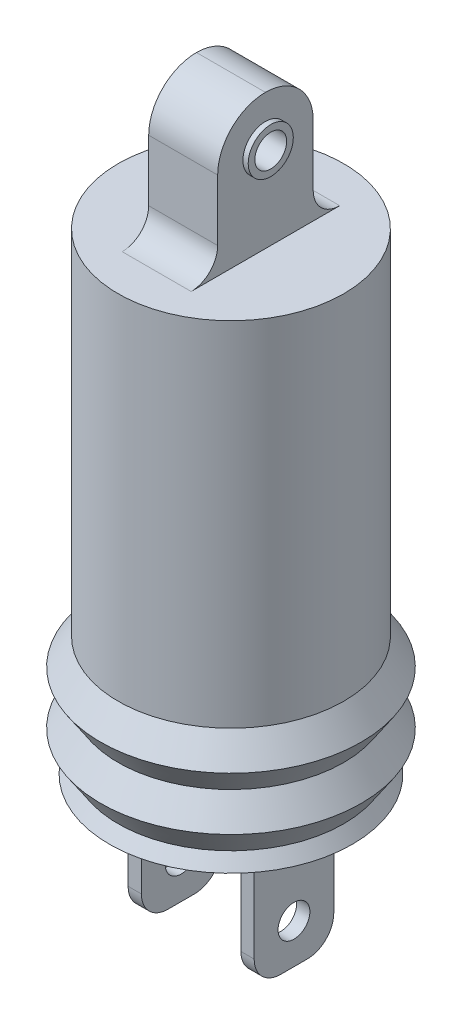
ISO-10303-21;
HEADER;
FILE_DESCRIPTION(('STEP AP214'),'2;1');
FILE_NAME('part.step','',(''),(''),'','','');
FILE_SCHEMA(('AUTOMOTIVE_DESIGN { 1 0 10303 214 1 1 1 1 }'));
ENDSEC;
DATA;
#1=APPLICATION_CONTEXT('core data for automotive mechanical design processes');
#2=APPLICATION_PROTOCOL_DEFINITION('international standard','automotive_design',2000,#1);
#3=PRODUCT_CONTEXT('',#1,'mechanical');
#4=PRODUCT('Part','Part','',(#3));
#5=PRODUCT_RELATED_PRODUCT_CATEGORY('part','',(#4));
#6=PRODUCT_DEFINITION_FORMATION('','',#4);
#7=PRODUCT_DEFINITION_CONTEXT('part definition',#1,'design');
#8=PRODUCT_DEFINITION('design','',#6,#7);
#9=PRODUCT_DEFINITION_SHAPE('','',#8);
#10=(LENGTH_UNIT() NAMED_UNIT(*) SI_UNIT(.MILLI.,.METRE.));
#11=(NAMED_UNIT(*) PLANE_ANGLE_UNIT() SI_UNIT($,.RADIAN.));
#12=(NAMED_UNIT(*) SI_UNIT($,.STERADIAN.) SOLID_ANGLE_UNIT());
#13=UNCERTAINTY_MEASURE_WITH_UNIT(LENGTH_MEASURE(1.E-05),#10,'distance_accuracy_value','');
#14=(GEOMETRIC_REPRESENTATION_CONTEXT(3) GLOBAL_UNCERTAINTY_ASSIGNED_CONTEXT((#13)) GLOBAL_UNIT_ASSIGNED_CONTEXT((#10,
#11,#12)) REPRESENTATION_CONTEXT('',''));
#15=CARTESIAN_POINT('',(0.,0.,0.));
#16=DIRECTION('',(0.,0.,1.));
#17=DIRECTION('',(1.,0.,0.));
#18=AXIS2_PLACEMENT_3D('',#15,#16,#17);
#19=CARTESIAN_POINT('',(13.,104.,18.));
#20=DIRECTION('',(-1.,0.,0.));
#21=DIRECTION('',(0.,0.,1.));
#22=AXIS2_PLACEMENT_3D('',#19,#20,#21);
#23=PLANE('',#22);
#24=CARTESIAN_POINT('',(13.,86.,0.));
#25=DIRECTION('',(-1.,0.,0.));
#26=DIRECTION('',(0.,0.,1.));
#27=AXIS2_PLACEMENT_3D('',#24,#25,#26);
#28=CIRCLE('',#27,18.);
#29=CARTESIAN_POINT('',(13.,86.,-18.));
#30=VERTEX_POINT('',#29);
#31=CARTESIAN_POINT('',(13.,104.,0.));
#32=VERTEX_POINT('',#31);
#33=EDGE_CURVE('E266',#30,#32,#28,.F.);
#34=ORIENTED_EDGE('',*,*,#33,.T.);
#35=CARTESIAN_POINT('',(13.,86.,0.));
#36=DIRECTION('',(-1.,0.,0.));
#37=DIRECTION('',(0.,0.,1.));
#38=AXIS2_PLACEMENT_3D('',#35,#36,#37);
#39=CIRCLE('',#38,18.);
#40=CARTESIAN_POINT('',(13.,86.,18.));
#41=VERTEX_POINT('',#40);
#42=EDGE_CURVE('E268',#32,#41,#39,.F.);
#43=ORIENTED_EDGE('',*,*,#42,.T.);
#44=DIRECTION('',(0.,-1.,0.));
#45=VECTOR('',#44,1.);
#46=CARTESIAN_POINT('',(13.,104.,18.));
#47=LINE('',#46,#45);
#48=CARTESIAN_POINT('',(13.,63.,18.));
#49=VERTEX_POINT('',#48);
#50=EDGE_CURVE('E225',#41,#49,#47,.T.);
#51=ORIENTED_EDGE('',*,*,#50,.T.);
#52=CARTESIAN_POINT('',(13.,63.,28.));
#53=DIRECTION('',(-1.,0.,0.));
#54=DIRECTION('',(0.,0.,1.));
#55=AXIS2_PLACEMENT_3D('',#52,#53,#54);
#56=CIRCLE('',#55,10.);
#57=CARTESIAN_POINT('',(13.,53.,28.));
#58=VERTEX_POINT('',#57);
#59=EDGE_CURVE('E295',#49,#58,#56,.T.);
#60=ORIENTED_EDGE('',*,*,#59,.T.);
#61=DIRECTION('',(0.,0.,-1.));
#62=VECTOR('',#61,1.);
#63=CARTESIAN_POINT('',(13.,53.,18.));
#64=LINE('',#63,#62);
#65=CARTESIAN_POINT('',(13.,53.,-28.));
#66=VERTEX_POINT('',#65);
#67=EDGE_CURVE('E221',#58,#66,#64,.T.);
#68=ORIENTED_EDGE('',*,*,#67,.T.);
#69=CARTESIAN_POINT('',(13.,63.,-28.));
#70=DIRECTION('',(-1.,0.,0.));
#71=DIRECTION('',(0.,0.,1.));
#72=AXIS2_PLACEMENT_3D('',#69,#70,#71);
#73=CIRCLE('',#72,10.);
#74=CARTESIAN_POINT('',(13.,63.,-18.));
#75=VERTEX_POINT('',#74);
#76=EDGE_CURVE('E303',#66,#75,#73,.T.);
#77=ORIENTED_EDGE('',*,*,#76,.T.);
#78=DIRECTION('',(0.,-1.,0.));
#79=VECTOR('',#78,1.);
#80=CARTESIAN_POINT('',(13.,104.,-18.));
#81=LINE('',#80,#79);
#82=EDGE_CURVE('E234',#30,#75,#81,.T.);
#83=ORIENTED_EDGE('',*,*,#82,.F.);
#84=EDGE_LOOP('',(#34,#43,#51,#60,#68,#77,#83));
#85=FACE_BOUND('',#84,.T.);
#86=CARTESIAN_POINT('',(13.,86.,0.));
#87=DIRECTION('',(-1.,0.,0.));
#88=DIRECTION('',(0.,0.,1.));
#89=AXIS2_PLACEMENT_3D('',#86,#87,#88);
#90=CIRCLE('',#89,8.50000000000001);
#91=CARTESIAN_POINT('',(13.,86.,8.50000000000001));
#92=VERTEX_POINT('',#91);
#93=EDGE_CURVE('E258',#92,#92,#90,.F.);
#94=ORIENTED_EDGE('',*,*,#93,.F.);
#95=EDGE_LOOP('',(#94));
#96=FACE_BOUND('',#95,.T.);
#97=ADVANCED_FACE('F34',(#85,#96),#23,.F.);
#98=CARTESIAN_POINT('',(0.,-129.999999999998,0.));
#99=DIRECTION('',(0.,-1.,0.));
#100=DIRECTION('',(0.,0.,-1.));
#101=AXIS2_PLACEMENT_3D('',#98,#99,#100);
#102=PLANE('',#101);
#103=DIRECTION('',(1.,0.,0.));
#104=VECTOR('',#103,1.);
#105=CARTESIAN_POINT('',(-23.75,-129.999999999998,-15.));
#106=LINE('',#105,#104);
#107=CARTESIAN_POINT('',(-18.75,-129.999999999998,-15.));
#108=VERTEX_POINT('',#107);
#109=CARTESIAN_POINT('',(18.75,-129.999999999998,-15.));
#110=VERTEX_POINT('',#109);
#111=EDGE_CURVE('E187',#108,#110,#106,.T.);
#112=ORIENTED_EDGE('',*,*,#111,.T.);
#113=DIRECTION('',(0.,0.,-1.));
#114=VECTOR('',#113,1.);
#115=CARTESIAN_POINT('',(18.75,-129.999999999998,-15.));
#116=LINE('',#115,#114);
#117=CARTESIAN_POINT('',(18.75,-129.999999999998,15.));
#118=VERTEX_POINT('',#117);
#119=EDGE_CURVE('E185',#118,#110,#116,.T.);
#120=ORIENTED_EDGE('',*,*,#119,.F.);
#121=DIRECTION('',(1.,0.,0.));
#122=VECTOR('',#121,1.);
#123=CARTESIAN_POINT('',(-23.75,-129.999999999998,15.));
#124=LINE('',#123,#122);
#125=CARTESIAN_POINT('',(-18.75,-129.999999999998,15.));
#126=VERTEX_POINT('',#125);
#127=EDGE_CURVE('E168',#126,#118,#124,.T.);
#128=ORIENTED_EDGE('',*,*,#127,.F.);
#129=DIRECTION('',(0.,0.,1.));
#130=VECTOR('',#129,1.);
#131=CARTESIAN_POINT('',(-18.75,-129.999999999998,-15.));
#132=LINE('',#131,#130);
#133=EDGE_CURVE('E182',#108,#126,#132,.T.);
#134=ORIENTED_EDGE('',*,*,#133,.F.);
#135=EDGE_LOOP('',(#112,#120,#128,#134));
#136=FACE_BOUND('',#135,.T.);
#137=ADVANCED_FACE('F181',(#136),#102,.T.);
#138=CARTESIAN_POINT('',(-45.816624790353,-124.999999999998,0.));
#139=DIRECTION('',(0.,1.,0.));
#140=DIRECTION('',(-1.,0.,0.));
#141=AXIS2_PLACEMENT_3D('',#138,#139,#140);
#142=PLANE('',#141);
#143=CARTESIAN_POINT('',(0.,-124.999999999998,0.));
#144=DIRECTION('',(0.,-1.,0.));
#145=DIRECTION('',(1.,0.,0.));
#146=AXIS2_PLACEMENT_3D('',#143,#144,#145);
#147=CIRCLE('',#146,45.816624790353);
#148=CARTESIAN_POINT('',(45.816624790353,-124.999999999998,0.));
#149=VERTEX_POINT('',#148);
#150=EDGE_CURVE('E240',#149,#149,#147,.T.);
#151=ORIENTED_EDGE('',*,*,#150,.T.);
#152=EDGE_LOOP('',(#151));
#153=FACE_BOUND('',#152,.T.);
#154=DIRECTION('',(1.,0.,0.));
#155=VECTOR('',#154,1.);
#156=CARTESIAN_POINT('',(-23.75,-124.999999999998,-15.));
#157=LINE('',#156,#155);
#158=CARTESIAN_POINT('',(-23.75,-124.999999999998,-15.));
#159=VERTEX_POINT('',#158);
#160=CARTESIAN_POINT('',(23.75,-124.999999999998,-15.));
#161=VERTEX_POINT('',#160);
#162=EDGE_CURVE('E201',#159,#161,#157,.T.);
#163=ORIENTED_EDGE('',*,*,#162,.F.);
#164=DIRECTION('',(0.,0.,1.));
#165=VECTOR('',#164,1.);
#166=CARTESIAN_POINT('',(-23.75,-124.999999999998,-15.));
#167=LINE('',#166,#165);
#168=CARTESIAN_POINT('',(-23.75,-124.999999999998,15.));
#169=VERTEX_POINT('',#168);
#170=EDGE_CURVE('E202',#159,#169,#167,.T.);
#171=ORIENTED_EDGE('',*,*,#170,.T.);
#172=DIRECTION('',(1.,0.,0.));
#173=VECTOR('',#172,1.);
#174=CARTESIAN_POINT('',(-23.75,-124.999999999998,15.));
#175=LINE('',#174,#173);
#176=CARTESIAN_POINT('',(23.75,-124.999999999998,15.));
#177=VERTEX_POINT('',#176);
#178=EDGE_CURVE('E209',#169,#177,#175,.T.);
#179=ORIENTED_EDGE('',*,*,#178,.T.);
#180=DIRECTION('',(0.,0.,1.));
#181=VECTOR('',#180,1.);
#182=CARTESIAN_POINT('',(23.75,-124.999999999998,-15.));
#183=LINE('',#182,#181);
#184=EDGE_CURVE('E206',#161,#177,#183,.T.);
#185=ORIENTED_EDGE('',*,*,#184,.F.);
#186=EDGE_LOOP('',(#163,#171,#179,#185));
#187=FACE_BOUND('',#186,.T.);
#188=ADVANCED_FACE('F356',(#153,#187),#142,.F.);
#189=CARTESIAN_POINT('',(-42.5,53.,0.));
#190=DIRECTION('',(0.,-1.,0.));
#191=DIRECTION('',(1.,0.,0.));
#192=AXIS2_PLACEMENT_3D('',#189,#190,#191);
#193=PLANE('',#192);
#194=CARTESIAN_POINT('',(0.,53.,0.));
#195=DIRECTION('',(0.,-1.,0.));
#196=DIRECTION('',(1.,0.,0.));
#197=AXIS2_PLACEMENT_3D('',#194,#195,#196);
#198=CIRCLE('',#197,42.5);
#199=CARTESIAN_POINT('',(42.5,53.,0.));
#200=VERTEX_POINT('',#199);
#201=EDGE_CURVE('E237',#200,#200,#198,.T.);
#202=ORIENTED_EDGE('',*,*,#201,.F.);
#203=EDGE_LOOP('',(#202));
#204=FACE_BOUND('',#203,.T.);
#205=ORIENTED_EDGE('',*,*,#67,.F.);
#206=DIRECTION('',(1.,0.,0.));
#207=VECTOR('',#206,1.);
#208=CARTESIAN_POINT('',(-13.,53.,28.));
#209=LINE('',#208,#207);
#210=CARTESIAN_POINT('',(-13.,53.,28.));
#211=VERTEX_POINT('',#210);
#212=EDGE_CURVE('E289',#58,#211,#209,.F.);
#213=ORIENTED_EDGE('',*,*,#212,.T.);
#214=DIRECTION('',(0.,0.,1.));
#215=VECTOR('',#214,1.);
#216=CARTESIAN_POINT('',(-13.,53.,18.));
#217=LINE('',#216,#215);
#218=CARTESIAN_POINT('',(-13.,53.,-28.));
#219=VERTEX_POINT('',#218);
#220=EDGE_CURVE('E223',#219,#211,#217,.T.);
#221=ORIENTED_EDGE('',*,*,#220,.F.);
#222=DIRECTION('',(-1.,0.,0.));
#223=VECTOR('',#222,1.);
#224=CARTESIAN_POINT('',(13.,53.,-28.));
#225=LINE('',#224,#223);
#226=EDGE_CURVE('E286',#219,#66,#225,.F.);
#227=ORIENTED_EDGE('',*,*,#226,.T.);
#228=EDGE_LOOP('',(#205,#213,#221,#227));
#229=FACE_BOUND('',#228,.T.);
#230=ADVANCED_FACE('F438',(#204,#229),#193,.F.);
#231=CARTESIAN_POINT('',(0.,-80.,0.));
#232=DIRECTION('',(0.,-1.,0.));
#233=DIRECTION('',(1.,0.,0.));
#234=AXIS2_PLACEMENT_3D('',#231,#232,#233);
#235=CONICAL_SURFACE('',#234,42.4999999999992,0.585685543457138);
#236=CARTESIAN_POINT('',(0.,-90.0000000000001,0.));
#237=DIRECTION('',(0.,-1.,0.));
#238=DIRECTION('',(1.,0.,0.));
#239=AXIS2_PLACEMENT_3D('',#236,#237,#238);
#240=CIRCLE('',#239,49.1332495807099);
#241=CARTESIAN_POINT('',(49.1332495807099,-90.0000000000001,0.));
#242=VERTEX_POINT('',#241);
#243=EDGE_CURVE('E252',#242,#242,#240,.T.);
#244=ORIENTED_EDGE('',*,*,#243,.F.);
#245=EDGE_LOOP('',(#244));
#246=FACE_BOUND('',#245,.T.);
#247=CARTESIAN_POINT('',(0.,-80.,0.));
#248=DIRECTION('',(0.,-1.,0.));
#249=DIRECTION('',(1.,0.,0.));
#250=AXIS2_PLACEMENT_3D('',#247,#248,#249);
#251=CIRCLE('',#250,42.4999999999992);
#252=CARTESIAN_POINT('',(42.4999999999992,-80.,0.));
#253=VERTEX_POINT('',#252);
#254=EDGE_CURVE('E255',#253,#253,#251,.T.);
#255=ORIENTED_EDGE('',*,*,#254,.T.);
#256=EDGE_LOOP('',(#255));
#257=FACE_BOUND('',#256,.T.);
#258=ADVANCED_FACE('F441',(#246,#257),#235,.T.);
#259=CARTESIAN_POINT('',(0.,-90.0000000000001,0.));
#260=DIRECTION('',(0.,1.,0.));
#261=DIRECTION('',(-1.,0.,0.));
#262=AXIS2_PLACEMENT_3D('',#259,#260,#261);
#263=CONICAL_SURFACE('',#262,49.1332495807099,0.585685543457162);
#264=CARTESIAN_POINT('',(0.,-100.,0.));
#265=DIRECTION('',(0.,-1.,0.));
#266=DIRECTION('',(1.,0.,0.));
#267=AXIS2_PLACEMENT_3D('',#264,#265,#266);
#268=CIRCLE('',#267,42.4999999999989);
#269=CARTESIAN_POINT('',(42.4999999999989,-100.,0.));
#270=VERTEX_POINT('',#269);
#271=EDGE_CURVE('E249',#270,#270,#268,.T.);
#272=ORIENTED_EDGE('',*,*,#271,.F.);
#273=EDGE_LOOP('',(#272));
#274=FACE_BOUND('',#273,.T.);
#275=ORIENTED_EDGE('',*,*,#243,.T.);
#276=EDGE_LOOP('',(#275));
#277=FACE_BOUND('',#276,.T.);
#278=ADVANCED_FACE('F456',(#274,#277),#263,.T.);
#279=CARTESIAN_POINT('',(0.,-100.,0.));
#280=DIRECTION('',(0.,-1.,0.));
#281=DIRECTION('',(1.,0.,0.));
#282=AXIS2_PLACEMENT_3D('',#279,#280,#281);
#283=CONICAL_SURFACE('',#282,42.4999999999989,0.58568554345714);
#284=CARTESIAN_POINT('',(0.,-110.,0.));
#285=DIRECTION('',(0.,-1.,0.));
#286=DIRECTION('',(1.,0.,0.));
#287=AXIS2_PLACEMENT_3D('',#284,#285,#286);
#288=CIRCLE('',#287,49.1332495807096);
#289=CARTESIAN_POINT('',(49.1332495807096,-110.,0.));
#290=VERTEX_POINT('',#289);
#291=EDGE_CURVE('E246',#290,#290,#288,.T.);
#292=ORIENTED_EDGE('',*,*,#291,.F.);
#293=EDGE_LOOP('',(#292));
#294=FACE_BOUND('',#293,.T.);
#295=ORIENTED_EDGE('',*,*,#271,.T.);
#296=EDGE_LOOP('',(#295));
#297=FACE_BOUND('',#296,.T.);
#298=ADVANCED_FACE('F452',(#294,#297),#283,.T.);
#299=CARTESIAN_POINT('',(0.,-110.,0.));
#300=DIRECTION('',(0.,1.,0.));
#301=DIRECTION('',(-1.,0.,0.));
#302=AXIS2_PLACEMENT_3D('',#299,#300,#301);
#303=CONICAL_SURFACE('',#302,49.1332495807096,0.585685543457163);
#304=CARTESIAN_POINT('',(0.,-120.,0.));
#305=DIRECTION('',(0.,-1.,0.));
#306=DIRECTION('',(1.,0.,0.));
#307=AXIS2_PLACEMENT_3D('',#304,#305,#306);
#308=CIRCLE('',#307,42.4999999999987);
#309=CARTESIAN_POINT('',(42.4999999999987,-120.,0.));
#310=VERTEX_POINT('',#309);
#311=EDGE_CURVE('E243',#310,#310,#308,.T.);
#312=ORIENTED_EDGE('',*,*,#311,.F.);
#313=EDGE_LOOP('',(#312));
#314=FACE_BOUND('',#313,.T.);
#315=ORIENTED_EDGE('',*,*,#291,.T.);
#316=EDGE_LOOP('',(#315));
#317=FACE_BOUND('',#316,.T.);
#318=ADVANCED_FACE('F448',(#314,#317),#303,.T.);
#319=CARTESIAN_POINT('',(0.,-120.,0.));
#320=DIRECTION('',(0.,-1.,0.));
#321=DIRECTION('',(1.,0.,0.));
#322=AXIS2_PLACEMENT_3D('',#319,#320,#321);
#323=CONICAL_SURFACE('',#322,42.4999999999987,0.585685543457146);
#324=ORIENTED_EDGE('',*,*,#150,.F.);
#325=EDGE_LOOP('',(#324));
#326=FACE_BOUND('',#325,.T.);
#327=ORIENTED_EDGE('',*,*,#311,.T.);
#328=EDGE_LOOP('',(#327));
#329=FACE_BOUND('',#328,.T.);
#330=ADVANCED_FACE('F436',(#326,#329),#323,.T.);
#331=CARTESIAN_POINT('',(0.,-124.999999999998,0.));
#332=DIRECTION('',(0.,-1.,0.));
#333=DIRECTION('',(1.,0.,0.));
#334=AXIS2_PLACEMENT_3D('',#331,#332,#333);
#335=CYLINDRICAL_SURFACE('',#334,42.5);
#336=ORIENTED_EDGE('',*,*,#254,.F.);
#337=EDGE_LOOP('',(#336));
#338=FACE_BOUND('',#337,.T.);
#339=ORIENTED_EDGE('',*,*,#201,.T.);
#340=EDGE_LOOP('',(#339));
#341=FACE_BOUND('',#340,.T.);
#342=ADVANCED_FACE('F433',(#338,#341),#335,.T.);
#343=CARTESIAN_POINT('',(-13.,104.,-18.));
#344=DIRECTION('',(0.,0.,1.));
#345=DIRECTION('',(1.,0.,0.));
#346=AXIS2_PLACEMENT_3D('',#343,#344,#345);
#347=PLANE('',#346);
#348=ORIENTED_EDGE('',*,*,#82,.T.);
#349=DIRECTION('',(-1.,0.,0.));
#350=VECTOR('',#349,1.);
#351=CARTESIAN_POINT('',(-13.,63.,-18.));
#352=LINE('',#351,#350);
#353=CARTESIAN_POINT('',(-13.,63.,-18.));
#354=VERTEX_POINT('',#353);
#355=EDGE_CURVE('E292',#75,#354,#352,.T.);
#356=ORIENTED_EDGE('',*,*,#355,.T.);
#357=DIRECTION('',(0.,-1.,0.));
#358=VECTOR('',#357,1.);
#359=CARTESIAN_POINT('',(-13.,104.,-18.));
#360=LINE('',#359,#358);
#361=CARTESIAN_POINT('',(-13.,86.,-18.));
#362=VERTEX_POINT('',#361);
#363=EDGE_CURVE('E231',#362,#354,#360,.T.);
#364=ORIENTED_EDGE('',*,*,#363,.F.);
#365=DIRECTION('',(-1.,0.,0.));
#366=VECTOR('',#365,1.);
#367=CARTESIAN_POINT('',(-13.,86.,-18.));
#368=LINE('',#367,#366);
#369=EDGE_CURVE('E277',#362,#30,#368,.F.);
#370=ORIENTED_EDGE('',*,*,#369,.T.);
#371=EDGE_LOOP('',(#348,#356,#364,#370));
#372=FACE_BOUND('',#371,.T.);
#373=ADVANCED_FACE('F431',(#372),#347,.F.);
#374=CARTESIAN_POINT('',(-13.,104.,18.));
#375=DIRECTION('',(1.,0.,0.));
#376=DIRECTION('',(0.,0.,-1.));
#377=AXIS2_PLACEMENT_3D('',#374,#375,#376);
#378=PLANE('',#377);
#379=CARTESIAN_POINT('',(-13.,86.,0.));
#380=DIRECTION('',(1.,0.,0.));
#381=DIRECTION('',(0.,0.,-1.));
#382=AXIS2_PLACEMENT_3D('',#379,#380,#381);
#383=CIRCLE('',#382,8.50000000000001);
#384=CARTESIAN_POINT('',(-13.,86.,-8.5));
#385=VERTEX_POINT('',#384);
#386=EDGE_CURVE('E394',#385,#385,#383,.T.);
#387=ORIENTED_EDGE('',*,*,#386,.T.);
#388=EDGE_LOOP('',(#387));
#389=FACE_BOUND('',#388,.T.);
#390=DIRECTION('',(0.,-1.,0.));
#391=VECTOR('',#390,1.);
#392=CARTESIAN_POINT('',(-13.,104.,18.));
#393=LINE('',#392,#391);
#394=CARTESIAN_POINT('',(-13.,86.,18.));
#395=VERTEX_POINT('',#394);
#396=CARTESIAN_POINT('',(-13.,63.,18.));
#397=VERTEX_POINT('',#396);
#398=EDGE_CURVE('E228',#395,#397,#393,.T.);
#399=ORIENTED_EDGE('',*,*,#398,.F.);
#400=CARTESIAN_POINT('',(-13.,86.,0.));
#401=DIRECTION('',(1.,0.,0.));
#402=DIRECTION('',(0.,0.,-1.));
#403=AXIS2_PLACEMENT_3D('',#400,#401,#402);
#404=CIRCLE('',#403,18.);
#405=CARTESIAN_POINT('',(-13.,104.,0.));
#406=VERTEX_POINT('',#405);
#407=EDGE_CURVE('E275',#395,#406,#404,.F.);
#408=ORIENTED_EDGE('',*,*,#407,.T.);
#409=CARTESIAN_POINT('',(-13.,86.,0.));
#410=DIRECTION('',(1.,0.,0.));
#411=DIRECTION('',(0.,0.,-1.));
#412=AXIS2_PLACEMENT_3D('',#409,#410,#411);
#413=CIRCLE('',#412,18.);
#414=EDGE_CURVE('E273',#406,#362,#413,.F.);
#415=ORIENTED_EDGE('',*,*,#414,.T.);
#416=ORIENTED_EDGE('',*,*,#363,.T.);
#417=CARTESIAN_POINT('',(-13.,63.,-28.));
#418=DIRECTION('',(1.,0.,0.));
#419=DIRECTION('',(0.,0.,-1.));
#420=AXIS2_PLACEMENT_3D('',#417,#418,#419);
#421=CIRCLE('',#420,10.);
#422=EDGE_CURVE('E300',#354,#219,#421,.T.);
#423=ORIENTED_EDGE('',*,*,#422,.T.);
#424=ORIENTED_EDGE('',*,*,#220,.T.);
#425=CARTESIAN_POINT('',(-13.,63.,28.));
#426=DIRECTION('',(1.,0.,0.));
#427=DIRECTION('',(0.,0.,-1.));
#428=AXIS2_PLACEMENT_3D('',#425,#426,#427);
#429=CIRCLE('',#428,10.);
#430=EDGE_CURVE('E298',#211,#397,#429,.T.);
#431=ORIENTED_EDGE('',*,*,#430,.T.);
#432=EDGE_LOOP('',(#399,#408,#415,#416,#423,#424,#431));
#433=FACE_BOUND('',#432,.T.);
#434=ADVANCED_FACE('F604',(#389,#433),#378,.F.);
#435=CARTESIAN_POINT('',(-13.,104.,18.));
#436=DIRECTION('',(0.,0.,-1.));
#437=DIRECTION('',(-1.,0.,0.));
#438=AXIS2_PLACEMENT_3D('',#435,#436,#437);
#439=PLANE('',#438);
#440=ORIENTED_EDGE('',*,*,#398,.T.);
#441=DIRECTION('',(1.,0.,0.));
#442=VECTOR('',#441,1.);
#443=CARTESIAN_POINT('',(13.,63.,18.));
#444=LINE('',#443,#442);
#445=EDGE_CURVE('E279',#397,#49,#444,.T.);
#446=ORIENTED_EDGE('',*,*,#445,.T.);
#447=ORIENTED_EDGE('',*,*,#50,.F.);
#448=DIRECTION('',(1.,0.,0.));
#449=VECTOR('',#448,1.);
#450=CARTESIAN_POINT('',(-13.,86.,18.));
#451=LINE('',#450,#449);
#452=EDGE_CURVE('E270',#41,#395,#451,.F.);
#453=ORIENTED_EDGE('',*,*,#452,.T.);
#454=EDGE_LOOP('',(#440,#446,#447,#453));
#455=FACE_BOUND('',#454,.T.);
#456=ADVANCED_FACE('F582',(#455),#439,.F.);
#457=CARTESIAN_POINT('',(-23.75,-129.999999999998,-15.));
#458=DIRECTION('',(0.,0.,1.));
#459=DIRECTION('',(1.,0.,0.));
#460=AXIS2_PLACEMENT_3D('',#457,#458,#459);
#461=PLANE('',#460);
#462=DIRECTION('',(0.,1.,0.));
#463=VECTOR('',#462,1.);
#464=CARTESIAN_POINT('',(23.75,-129.999999999998,-15.));
#465=LINE('',#464,#463);
#466=CARTESIAN_POINT('',(23.75,-165.999999999998,-15.));
#467=VERTEX_POINT('',#466);
#468=EDGE_CURVE('E219',#467,#161,#465,.T.);
#469=ORIENTED_EDGE('',*,*,#468,.F.);
#470=DIRECTION('',(1.,0.,0.));
#471=VECTOR('',#470,1.);
#472=CARTESIAN_POINT('',(18.75,-165.999999999998,-15.));
#473=LINE('',#472,#471);
#474=CARTESIAN_POINT('',(18.75,-165.999999999998,-15.));
#475=VERTEX_POINT('',#474);
#476=EDGE_CURVE('E11',#467,#475,#473,.F.);
#477=ORIENTED_EDGE('',*,*,#476,.T.);
#478=DIRECTION('',(0.,1.,0.));
#479=VECTOR('',#478,1.);
#480=CARTESIAN_POINT('',(18.75,-175.999999999998,-15.));
#481=LINE('',#480,#479);
#482=EDGE_CURVE('E196',#475,#110,#481,.T.);
#483=ORIENTED_EDGE('',*,*,#482,.T.);
#484=ORIENTED_EDGE('',*,*,#111,.F.);
#485=DIRECTION('',(0.,1.,0.));
#486=VECTOR('',#485,1.);
#487=CARTESIAN_POINT('',(-18.75,-175.999999999998,-15.));
#488=LINE('',#487,#486);
#489=CARTESIAN_POINT('',(-18.75,-165.999999999998,-15.));
#490=VERTEX_POINT('',#489);
#491=EDGE_CURVE('E174',#490,#108,#488,.T.);
#492=ORIENTED_EDGE('',*,*,#491,.F.);
#493=DIRECTION('',(1.,0.,0.));
#494=VECTOR('',#493,1.);
#495=CARTESIAN_POINT('',(-23.75,-165.999999999998,-15.));
#496=LINE('',#495,#494);
#497=CARTESIAN_POINT('',(-23.75,-165.999999999998,-15.));
#498=VERTEX_POINT('',#497);
#499=EDGE_CURVE('E42',#490,#498,#496,.F.);
#500=ORIENTED_EDGE('',*,*,#499,.T.);
#501=DIRECTION('',(0.,1.,0.));
#502=VECTOR('',#501,1.);
#503=CARTESIAN_POINT('',(-23.75,-129.999999999998,-15.));
#504=LINE('',#503,#502);
#505=EDGE_CURVE('E186',#498,#159,#504,.T.);
#506=ORIENTED_EDGE('',*,*,#505,.T.);
#507=ORIENTED_EDGE('',*,*,#162,.T.);
#508=EDGE_LOOP('',(#469,#477,#483,#484,#492,#500,#506,#507));
#509=FACE_BOUND('',#508,.T.);
#510=ADVANCED_FACE('F336',(#509),#461,.F.);
#511=CARTESIAN_POINT('',(23.75,-129.999999999998,-15.));
#512=DIRECTION('',(-1.,0.,0.));
#513=DIRECTION('',(0.,0.,1.));
#514=AXIS2_PLACEMENT_3D('',#511,#512,#513);
#515=PLANE('',#514);
#516=CARTESIAN_POINT('',(23.75,-160.999999999998,0.));
#517=DIRECTION('',(1.,0.,0.));
#518=DIRECTION('',(0.,0.,-1.));
#519=AXIS2_PLACEMENT_3D('',#516,#517,#518);
#520=CIRCLE('',#519,6.00000000000001);
#521=CARTESIAN_POINT('',(23.75,-160.999999999998,-6.00000000000001));
#522=VERTEX_POINT('',#521);
#523=EDGE_CURVE('E263',#522,#522,#520,.T.);
#524=ORIENTED_EDGE('',*,*,#523,.F.);
#525=EDGE_LOOP('',(#524));
#526=FACE_BOUND('',#525,.T.);
#527=DIRECTION('',(0.,1.,0.));
#528=VECTOR('',#527,1.);
#529=CARTESIAN_POINT('',(23.75,-129.999999999998,15.));
#530=LINE('',#529,#528);
#531=CARTESIAN_POINT('',(23.75,-165.999999999998,15.));
#532=VERTEX_POINT('',#531);
#533=EDGE_CURVE('E217',#532,#177,#530,.T.);
#534=ORIENTED_EDGE('',*,*,#533,.F.);
#535=CARTESIAN_POINT('',(23.75,-165.999999999998,5.));
#536=DIRECTION('',(-1.,0.,0.));
#537=DIRECTION('',(0.,0.,1.));
#538=AXIS2_PLACEMENT_3D('',#535,#536,#537);
#539=CIRCLE('',#538,10.);
#540=CARTESIAN_POINT('',(23.75,-175.999999999998,5.));
#541=VERTEX_POINT('',#540);
#542=EDGE_CURVE('E333',#532,#541,#539,.F.);
#543=ORIENTED_EDGE('',*,*,#542,.T.);
#544=DIRECTION('',(0.,0.,1.));
#545=VECTOR('',#544,1.);
#546=CARTESIAN_POINT('',(23.75,-175.999999999998,-15.));
#547=LINE('',#546,#545);
#548=CARTESIAN_POINT('',(23.75,-175.999999999998,-5.));
#549=VERTEX_POINT('',#548);
#550=EDGE_CURVE('E372',#549,#541,#547,.T.);
#551=ORIENTED_EDGE('',*,*,#550,.F.);
#552=CARTESIAN_POINT('',(23.75,-165.999999999998,-5.));
#553=DIRECTION('',(-1.,0.,0.));
#554=DIRECTION('',(0.,0.,1.));
#555=AXIS2_PLACEMENT_3D('',#552,#553,#554);
#556=CIRCLE('',#555,10.);
#557=EDGE_CURVE('E49',#549,#467,#556,.F.);
#558=ORIENTED_EDGE('',*,*,#557,.T.);
#559=ORIENTED_EDGE('',*,*,#468,.T.);
#560=ORIENTED_EDGE('',*,*,#184,.T.);
#561=EDGE_LOOP('',(#534,#543,#551,#558,#559,#560));
#562=FACE_BOUND('',#561,.T.);
#563=ADVANCED_FACE('F357',(#526,#562),#515,.F.);
#564=CARTESIAN_POINT('',(-23.75,-129.999999999998,15.));
#565=DIRECTION('',(0.,0.,1.));
#566=DIRECTION('',(1.,0.,0.));
#567=AXIS2_PLACEMENT_3D('',#564,#565,#566);
#568=PLANE('',#567);
#569=DIRECTION('',(0.,1.,0.));
#570=VECTOR('',#569,1.);
#571=CARTESIAN_POINT('',(-23.75,-129.999999999998,15.));
#572=LINE('',#571,#570);
#573=CARTESIAN_POINT('',(-23.75,-165.999999999998,15.));
#574=VERTEX_POINT('',#573);
#575=EDGE_CURVE('E215',#574,#169,#572,.T.);
#576=ORIENTED_EDGE('',*,*,#575,.F.);
#577=DIRECTION('',(-1.,0.,0.));
#578=VECTOR('',#577,1.);
#579=CARTESIAN_POINT('',(-18.75,-165.999999999998,15.));
#580=LINE('',#579,#578);
#581=CARTESIAN_POINT('',(-18.75,-165.999999999998,15.));
#582=VERTEX_POINT('',#581);
#583=EDGE_CURVE('E170',#574,#582,#580,.F.);
#584=ORIENTED_EDGE('',*,*,#583,.T.);
#585=DIRECTION('',(0.,1.,0.));
#586=VECTOR('',#585,1.);
#587=CARTESIAN_POINT('',(-18.75,-175.999999999998,15.));
#588=LINE('',#587,#586);
#589=EDGE_CURVE('E163',#582,#126,#588,.T.);
#590=ORIENTED_EDGE('',*,*,#589,.T.);
#591=ORIENTED_EDGE('',*,*,#127,.T.);
#592=DIRECTION('',(0.,1.,0.));
#593=VECTOR('',#592,1.);
#594=CARTESIAN_POINT('',(18.75,-175.999999999998,15.));
#595=LINE('',#594,#593);
#596=CARTESIAN_POINT('',(18.75,-165.999999999998,15.));
#597=VERTEX_POINT('',#596);
#598=EDGE_CURVE('E192',#597,#118,#595,.T.);
#599=ORIENTED_EDGE('',*,*,#598,.F.);
#600=DIRECTION('',(-1.,0.,0.));
#601=VECTOR('',#600,1.);
#602=CARTESIAN_POINT('',(-23.75,-165.999999999998,15.));
#603=LINE('',#602,#601);
#604=EDGE_CURVE('E315',#597,#532,#603,.F.);
#605=ORIENTED_EDGE('',*,*,#604,.T.);
#606=ORIENTED_EDGE('',*,*,#533,.T.);
#607=ORIENTED_EDGE('',*,*,#178,.F.);
#608=EDGE_LOOP('',(#576,#584,#590,#591,#599,#605,#606,#607));
#609=FACE_BOUND('',#608,.T.);
#610=ADVANCED_FACE('F166',(#609),#568,.T.);
#611=CARTESIAN_POINT('',(-23.75,-129.999999999998,-15.));
#612=DIRECTION('',(-1.,0.,0.));
#613=DIRECTION('',(0.,0.,1.));
#614=AXIS2_PLACEMENT_3D('',#611,#612,#613);
#615=PLANE('',#614);
#616=CARTESIAN_POINT('',(-23.75,-160.999999999998,0.));
#617=DIRECTION('',(-1.,0.,0.));
#618=DIRECTION('',(0.,0.,1.));
#619=AXIS2_PLACEMENT_3D('',#616,#617,#618);
#620=CIRCLE('',#619,6.00000000000001);
#621=CARTESIAN_POINT('',(-23.75,-160.999999999998,6.00000000000001));
#622=VERTEX_POINT('',#621);
#623=EDGE_CURVE('E378',#622,#622,#620,.T.);
#624=ORIENTED_EDGE('',*,*,#623,.F.);
#625=EDGE_LOOP('',(#624));
#626=FACE_BOUND('',#625,.T.);
#627=DIRECTION('',(0.,0.,-1.));
#628=VECTOR('',#627,1.);
#629=CARTESIAN_POINT('',(-23.75,-175.999999999998,-15.));
#630=LINE('',#629,#628);
#631=CARTESIAN_POINT('',(-23.75,-175.999999999998,5.));
#632=VERTEX_POINT('',#631);
#633=CARTESIAN_POINT('',(-23.75,-175.999999999998,-5.));
#634=VERTEX_POINT('',#633);
#635=EDGE_CURVE('E191',#632,#634,#630,.T.);
#636=ORIENTED_EDGE('',*,*,#635,.F.);
#637=CARTESIAN_POINT('',(-23.75,-165.999999999998,5.));
#638=DIRECTION('',(-1.,0.,0.));
#639=DIRECTION('',(0.,0.,1.));
#640=AXIS2_PLACEMENT_3D('',#637,#638,#639);
#641=CIRCLE('',#640,10.);
#642=EDGE_CURVE('E313',#632,#574,#641,.T.);
#643=ORIENTED_EDGE('',*,*,#642,.T.);
#644=ORIENTED_EDGE('',*,*,#575,.T.);
#645=ORIENTED_EDGE('',*,*,#170,.F.);
#646=ORIENTED_EDGE('',*,*,#505,.F.);
#647=CARTESIAN_POINT('',(-23.75,-165.999999999998,-5.));
#648=DIRECTION('',(-1.,0.,0.));
#649=DIRECTION('',(0.,0.,1.));
#650=AXIS2_PLACEMENT_3D('',#647,#648,#649);
#651=CIRCLE('',#650,10.);
#652=EDGE_CURVE('E311',#498,#634,#651,.T.);
#653=ORIENTED_EDGE('',*,*,#652,.T.);
#654=EDGE_LOOP('',(#636,#643,#644,#645,#646,#653));
#655=FACE_BOUND('',#654,.T.);
#656=ADVANCED_FACE('F343',(#626,#655),#615,.T.);
#657=CARTESIAN_POINT('',(-18.75,-175.999999999998,-15.));
#658=DIRECTION('',(-1.,0.,0.));
#659=DIRECTION('',(0.,0.,1.));
#660=AXIS2_PLACEMENT_3D('',#657,#658,#659);
#661=PLANE('',#660);
#662=CARTESIAN_POINT('',(-18.75,-160.999999999998,0.));
#663=DIRECTION('',(-1.,0.,0.));
#664=DIRECTION('',(0.,0.,1.));
#665=AXIS2_PLACEMENT_3D('',#662,#663,#664);
#666=CIRCLE('',#665,6.00000000000001);
#667=CARTESIAN_POINT('',(-18.75,-160.999999999998,6.00000000000001));
#668=VERTEX_POINT('',#667);
#669=EDGE_CURVE('E262',#668,#668,#666,.T.);
#670=ORIENTED_EDGE('',*,*,#669,.T.);
#671=EDGE_LOOP('',(#670));
#672=FACE_BOUND('',#671,.T.);
#673=ORIENTED_EDGE('',*,*,#589,.F.);
#674=CARTESIAN_POINT('',(-18.75,-165.999999999998,5.));
#675=DIRECTION('',(-1.,0.,0.));
#676=DIRECTION('',(0.,0.,1.));
#677=AXIS2_PLACEMENT_3D('',#674,#675,#676);
#678=CIRCLE('',#677,10.);
#679=CARTESIAN_POINT('',(-18.75,-175.999999999998,5.));
#680=VERTEX_POINT('',#679);
#681=EDGE_CURVE('E320',#582,#680,#678,.F.);
#682=ORIENTED_EDGE('',*,*,#681,.T.);
#683=DIRECTION('',(0.,0.,1.));
#684=VECTOR('',#683,1.);
#685=CARTESIAN_POINT('',(-18.75,-175.999999999998,-15.));
#686=LINE('',#685,#684);
#687=CARTESIAN_POINT('',(-18.75,-175.999999999998,-5.));
#688=VERTEX_POINT('',#687);
#689=EDGE_CURVE('E175',#688,#680,#686,.T.);
#690=ORIENTED_EDGE('',*,*,#689,.F.);
#691=CARTESIAN_POINT('',(-18.75,-165.999999999998,-5.));
#692=DIRECTION('',(-1.,0.,0.));
#693=DIRECTION('',(0.,0.,1.));
#694=AXIS2_PLACEMENT_3D('',#691,#692,#693);
#695=CIRCLE('',#694,10.);
#696=EDGE_CURVE('E318',#688,#490,#695,.F.);
#697=ORIENTED_EDGE('',*,*,#696,.T.);
#698=ORIENTED_EDGE('',*,*,#491,.T.);
#699=ORIENTED_EDGE('',*,*,#133,.T.);
#700=EDGE_LOOP('',(#673,#682,#690,#697,#698,#699));
#701=FACE_BOUND('',#700,.T.);
#702=ADVANCED_FACE('F189',(#672,#701),#661,.F.);
#703=CARTESIAN_POINT('',(0.,-175.999999999998,0.));
#704=DIRECTION('',(0.,1.,0.));
#705=DIRECTION('',(0.,0.,1.));
#706=AXIS2_PLACEMENT_3D('',#703,#704,#705);
#707=PLANE('',#706);
#708=ORIENTED_EDGE('',*,*,#689,.T.);
#709=DIRECTION('',(-1.,0.,0.));
#710=VECTOR('',#709,1.);
#711=CARTESIAN_POINT('',(-23.75,-175.999999999998,5.));
#712=LINE('',#711,#710);
#713=EDGE_CURVE('E308',#680,#632,#712,.T.);
#714=ORIENTED_EDGE('',*,*,#713,.T.);
#715=ORIENTED_EDGE('',*,*,#635,.T.);
#716=DIRECTION('',(1.,0.,0.));
#717=VECTOR('',#716,1.);
#718=CARTESIAN_POINT('',(0.,-175.999999999998,-5.));
#719=LINE('',#718,#717);
#720=EDGE_CURVE('E305',#634,#688,#719,.T.);
#721=ORIENTED_EDGE('',*,*,#720,.T.);
#722=EDGE_LOOP('',(#708,#714,#715,#721));
#723=FACE_BOUND('',#722,.T.);
#724=ADVANCED_FACE('F348',(#723),#707,.F.);
#725=CARTESIAN_POINT('',(18.75,-175.999999999998,-15.));
#726=DIRECTION('',(1.,0.,0.));
#727=DIRECTION('',(0.,0.,-1.));
#728=AXIS2_PLACEMENT_3D('',#725,#726,#727);
#729=PLANE('',#728);
#730=CARTESIAN_POINT('',(18.75,-160.999999999998,0.));
#731=DIRECTION('',(1.,0.,0.));
#732=DIRECTION('',(0.,0.,-1.));
#733=AXIS2_PLACEMENT_3D('',#730,#731,#732);
#734=CIRCLE('',#733,6.00000000000001);
#735=CARTESIAN_POINT('',(18.75,-160.999999999998,-6.00000000000001));
#736=VERTEX_POINT('',#735);
#737=EDGE_CURVE('E259',#736,#736,#734,.T.);
#738=ORIENTED_EDGE('',*,*,#737,.T.);
#739=EDGE_LOOP('',(#738));
#740=FACE_BOUND('',#739,.T.);
#741=DIRECTION('',(0.,0.,-1.));
#742=VECTOR('',#741,1.);
#743=CARTESIAN_POINT('',(18.75,-175.999999999998,-15.));
#744=LINE('',#743,#742);
#745=CARTESIAN_POINT('',(18.75,-175.999999999998,5.));
#746=VERTEX_POINT('',#745);
#747=CARTESIAN_POINT('',(18.75,-175.999999999998,-5.));
#748=VERTEX_POINT('',#747);
#749=EDGE_CURVE('E367',#746,#748,#744,.T.);
#750=ORIENTED_EDGE('',*,*,#749,.F.);
#751=CARTESIAN_POINT('',(18.75,-165.999999999998,5.));
#752=DIRECTION('',(1.,0.,0.));
#753=DIRECTION('',(0.,0.,-1.));
#754=AXIS2_PLACEMENT_3D('',#751,#752,#753);
#755=CIRCLE('',#754,10.);
#756=EDGE_CURVE('E330',#746,#597,#755,.F.);
#757=ORIENTED_EDGE('',*,*,#756,.T.);
#758=ORIENTED_EDGE('',*,*,#598,.T.);
#759=ORIENTED_EDGE('',*,*,#119,.T.);
#760=ORIENTED_EDGE('',*,*,#482,.F.);
#761=CARTESIAN_POINT('',(18.75,-165.999999999998,-5.));
#762=DIRECTION('',(1.,0.,0.));
#763=DIRECTION('',(0.,0.,-1.));
#764=AXIS2_PLACEMENT_3D('',#761,#762,#763);
#765=CIRCLE('',#764,10.);
#766=EDGE_CURVE('E328',#475,#748,#765,.F.);
#767=ORIENTED_EDGE('',*,*,#766,.T.);
#768=EDGE_LOOP('',(#750,#757,#758,#759,#760,#767));
#769=FACE_BOUND('',#768,.T.);
#770=ADVANCED_FACE('F366',(#740,#769),#729,.F.);
#771=CARTESIAN_POINT('',(0.,-175.999999999998,0.));
#772=DIRECTION('',(0.,-1.,0.));
#773=DIRECTION('',(0.,0.,-1.));
#774=AXIS2_PLACEMENT_3D('',#771,#772,#773);
#775=PLANE('',#774);
#776=ORIENTED_EDGE('',*,*,#550,.T.);
#777=DIRECTION('',(-1.,0.,0.));
#778=VECTOR('',#777,1.);
#779=CARTESIAN_POINT('',(0.,-175.999999999998,5.));
#780=LINE('',#779,#778);
#781=EDGE_CURVE('E325',#541,#746,#780,.T.);
#782=ORIENTED_EDGE('',*,*,#781,.T.);
#783=ORIENTED_EDGE('',*,*,#749,.T.);
#784=DIRECTION('',(1.,0.,0.));
#785=VECTOR('',#784,1.);
#786=CARTESIAN_POINT('',(23.75,-175.999999999998,-5.));
#787=LINE('',#786,#785);
#788=EDGE_CURVE('E322',#748,#549,#787,.T.);
#789=ORIENTED_EDGE('',*,*,#788,.T.);
#790=EDGE_LOOP('',(#776,#782,#783,#789));
#791=FACE_BOUND('',#790,.T.);
#792=ADVANCED_FACE('F370',(#791),#775,.T.);
#793=CARTESIAN_POINT('',(-49.1332495807098,-160.999999999998,0.));
#794=DIRECTION('',(1.,0.,0.));
#795=DIRECTION('',(0.,0.,-1.));
#796=AXIS2_PLACEMENT_3D('',#793,#794,#795);
#797=CYLINDRICAL_SURFACE('',#796,6.00000000000001);
#798=ORIENTED_EDGE('',*,*,#523,.T.);
#799=EDGE_LOOP('',(#798));
#800=FACE_BOUND('',#799,.T.);
#801=ORIENTED_EDGE('',*,*,#737,.F.);
#802=EDGE_LOOP('',(#801));
#803=FACE_BOUND('',#802,.T.);
#804=ADVANCED_FACE('F418',(#800,#803),#797,.F.);
#805=ORIENTED_EDGE('',*,*,#623,.T.);
#806=EDGE_LOOP('',(#805));
#807=FACE_BOUND('',#806,.T.);
#808=ORIENTED_EDGE('',*,*,#669,.F.);
#809=EDGE_LOOP('',(#808));
#810=FACE_BOUND('',#809,.T.);
#811=ADVANCED_FACE('F408',(#807,#810),#797,.F.);
#812=CARTESIAN_POINT('',(-33.,86.,0.));
#813=DIRECTION('',(1.,0.,0.));
#814=DIRECTION('',(0.,0.,-1.));
#815=AXIS2_PLACEMENT_3D('',#812,#813,#814);
#816=CYLINDRICAL_SURFACE('',#815,6.00000000000001);
#817=CARTESIAN_POINT('',(15.,86.,0.));
#818=DIRECTION('',(1.,0.,0.));
#819=DIRECTION('',(0.,0.,-1.));
#820=AXIS2_PLACEMENT_3D('',#817,#818,#819);
#821=CIRCLE('',#820,6.00000000000001);
#822=CARTESIAN_POINT('',(15.,86.,-6.));
#823=VERTEX_POINT('',#822);
#824=EDGE_CURVE('E390',#823,#823,#821,.T.);
#825=ORIENTED_EDGE('',*,*,#824,.T.);
#826=EDGE_LOOP('',(#825));
#827=FACE_BOUND('',#826,.T.);
#828=CARTESIAN_POINT('',(-15.,86.,0.));
#829=DIRECTION('',(1.,0.,0.));
#830=DIRECTION('',(0.,0.,-1.));
#831=AXIS2_PLACEMENT_3D('',#828,#829,#830);
#832=CIRCLE('',#831,6.00000000000001);
#833=CARTESIAN_POINT('',(-15.,86.,-6.));
#834=VERTEX_POINT('',#833);
#835=EDGE_CURVE('E283',#834,#834,#832,.T.);
#836=ORIENTED_EDGE('',*,*,#835,.F.);
#837=EDGE_LOOP('',(#836));
#838=FACE_BOUND('',#837,.T.);
#839=ADVANCED_FACE('F405',(#827,#838),#816,.F.);
#840=CARTESIAN_POINT('',(15.,86.,0.));
#841=DIRECTION('',(1.,0.,0.));
#842=DIRECTION('',(0.,0.,-1.));
#843=AXIS2_PLACEMENT_3D('',#840,#841,#842);
#844=PLANE('',#843);
#845=CARTESIAN_POINT('',(15.,86.,0.));
#846=DIRECTION('',(1.,0.,0.));
#847=DIRECTION('',(0.,0.,-1.));
#848=AXIS2_PLACEMENT_3D('',#845,#846,#847);
#849=CIRCLE('',#848,8.50000000000001);
#850=CARTESIAN_POINT('',(15.,86.,-8.5));
#851=VERTEX_POINT('',#850);
#852=EDGE_CURVE('E387',#851,#851,#849,.T.);
#853=ORIENTED_EDGE('',*,*,#852,.T.);
#854=EDGE_LOOP('',(#853));
#855=FACE_BOUND('',#854,.T.);
#856=ORIENTED_EDGE('',*,*,#824,.F.);
#857=EDGE_LOOP('',(#856));
#858=FACE_BOUND('',#857,.T.);
#859=ADVANCED_FACE('F407',(#855,#858),#844,.T.);
#860=CARTESIAN_POINT('',(15.,86.,0.));
#861=DIRECTION('',(-1.,0.,0.));
#862=DIRECTION('',(0.,0.,1.));
#863=AXIS2_PLACEMENT_3D('',#860,#861,#862);
#864=CYLINDRICAL_SURFACE('',#863,8.50000000000001);
#865=ORIENTED_EDGE('',*,*,#852,.F.);
#866=EDGE_LOOP('',(#865));
#867=FACE_BOUND('',#866,.T.);
#868=ORIENTED_EDGE('',*,*,#93,.T.);
#869=EDGE_LOOP('',(#868));
#870=FACE_BOUND('',#869,.T.);
#871=ADVANCED_FACE('F415',(#867,#870),#864,.T.);
#872=CARTESIAN_POINT('',(-15.,86.,0.));
#873=DIRECTION('',(1.,0.,0.));
#874=DIRECTION('',(0.,0.,-1.));
#875=AXIS2_PLACEMENT_3D('',#872,#873,#874);
#876=CYLINDRICAL_SURFACE('',#875,8.50000000000001);
#877=CARTESIAN_POINT('',(-15.,86.,0.));
#878=DIRECTION('',(1.,0.,0.));
#879=DIRECTION('',(0.,0.,-1.));
#880=AXIS2_PLACEMENT_3D('',#877,#878,#879);
#881=CIRCLE('',#880,8.50000000000001);
#882=CARTESIAN_POINT('',(-15.,86.,-8.5));
#883=VERTEX_POINT('',#882);
#884=EDGE_CURVE('E393',#883,#883,#881,.T.);
#885=ORIENTED_EDGE('',*,*,#884,.T.);
#886=EDGE_LOOP('',(#885));
#887=FACE_BOUND('',#886,.T.);
#888=ORIENTED_EDGE('',*,*,#386,.F.);
#889=EDGE_LOOP('',(#888));
#890=FACE_BOUND('',#889,.T.);
#891=ADVANCED_FACE('F655',(#887,#890),#876,.T.);
#892=CARTESIAN_POINT('',(-15.,86.,0.));
#893=DIRECTION('',(-1.,0.,0.));
#894=DIRECTION('',(0.,0.,-1.));
#895=AXIS2_PLACEMENT_3D('',#892,#893,#894);
#896=PLANE('',#895);
#897=ORIENTED_EDGE('',*,*,#835,.T.);
#898=EDGE_LOOP('',(#897));
#899=FACE_BOUND('',#898,.T.);
#900=ORIENTED_EDGE('',*,*,#884,.F.);
#901=EDGE_LOOP('',(#900));
#902=FACE_BOUND('',#901,.T.);
#903=ADVANCED_FACE('F402',(#899,#902),#896,.T.);
#904=CARTESIAN_POINT('',(0.,86.,0.));
#905=DIRECTION('',(-1.,0.,0.));
#906=DIRECTION('',(0.,0.,1.));
#907=AXIS2_PLACEMENT_3D('',#904,#905,#906);
#908=CYLINDRICAL_SURFACE('',#907,18.);
#909=ORIENTED_EDGE('',*,*,#369,.F.);
#910=ORIENTED_EDGE('',*,*,#414,.F.);
#911=DIRECTION('',(-1.,0.,0.));
#912=VECTOR('',#911,1.);
#913=CARTESIAN_POINT('',(0.,104.,0.));
#914=LINE('',#913,#912);
#915=EDGE_CURVE('E280',#32,#406,#914,.T.);
#916=ORIENTED_EDGE('',*,*,#915,.F.);
#917=ORIENTED_EDGE('',*,*,#33,.F.);
#918=EDGE_LOOP('',(#909,#910,#916,#917));
#919=FACE_BOUND('',#918,.T.);
#920=ADVANCED_FACE('F468',(#919),#908,.T.);
#921=CARTESIAN_POINT('',(0.,86.,0.));
#922=DIRECTION('',(1.,0.,0.));
#923=DIRECTION('',(0.,0.,-1.));
#924=AXIS2_PLACEMENT_3D('',#921,#922,#923);
#925=CYLINDRICAL_SURFACE('',#924,18.);
#926=ORIENTED_EDGE('',*,*,#407,.F.);
#927=ORIENTED_EDGE('',*,*,#452,.F.);
#928=ORIENTED_EDGE('',*,*,#42,.F.);
#929=ORIENTED_EDGE('',*,*,#915,.T.);
#930=EDGE_LOOP('',(#926,#927,#928,#929));
#931=FACE_BOUND('',#930,.T.);
#932=ADVANCED_FACE('F464',(#931),#925,.T.);
#933=CARTESIAN_POINT('',(-13.,63.,28.));
#934=DIRECTION('',(-1.,0.,0.));
#935=DIRECTION('',(0.,-1.,0.));
#936=AXIS2_PLACEMENT_3D('',#933,#934,#935);
#937=CYLINDRICAL_SURFACE('',#936,10.);
#938=ORIENTED_EDGE('',*,*,#430,.F.);
#939=ORIENTED_EDGE('',*,*,#212,.F.);
#940=ORIENTED_EDGE('',*,*,#59,.F.);
#941=ORIENTED_EDGE('',*,*,#445,.F.);
#942=EDGE_LOOP('',(#938,#939,#940,#941));
#943=FACE_BOUND('',#942,.T.);
#944=ADVANCED_FACE('F467',(#943),#937,.F.);
#945=CARTESIAN_POINT('',(-13.,63.,-28.));
#946=DIRECTION('',(1.,0.,0.));
#947=DIRECTION('',(0.,1.,0.));
#948=AXIS2_PLACEMENT_3D('',#945,#946,#947);
#949=CYLINDRICAL_SURFACE('',#948,10.);
#950=ORIENTED_EDGE('',*,*,#76,.F.);
#951=ORIENTED_EDGE('',*,*,#226,.F.);
#952=ORIENTED_EDGE('',*,*,#422,.F.);
#953=ORIENTED_EDGE('',*,*,#355,.F.);
#954=EDGE_LOOP('',(#950,#951,#952,#953));
#955=FACE_BOUND('',#954,.T.);
#956=ADVANCED_FACE('F475',(#955),#949,.F.);
#957=CARTESIAN_POINT('',(0.,-165.999999999998,5.));
#958=DIRECTION('',(1.,0.,0.));
#959=DIRECTION('',(0.,0.,-1.));
#960=AXIS2_PLACEMENT_3D('',#957,#958,#959);
#961=CYLINDRICAL_SURFACE('',#960,10.);
#962=ORIENTED_EDGE('',*,*,#681,.F.);
#963=ORIENTED_EDGE('',*,*,#583,.F.);
#964=ORIENTED_EDGE('',*,*,#642,.F.);
#965=ORIENTED_EDGE('',*,*,#713,.F.);
#966=EDGE_LOOP('',(#962,#963,#964,#965));
#967=FACE_BOUND('',#966,.T.);
#968=ADVANCED_FACE('F351',(#967),#961,.T.);
#969=CARTESIAN_POINT('',(0.,-165.999999999998,5.));
#970=DIRECTION('',(-1.,0.,0.));
#971=DIRECTION('',(0.,0.,1.));
#972=AXIS2_PLACEMENT_3D('',#969,#970,#971);
#973=CYLINDRICAL_SURFACE('',#972,10.);
#974=ORIENTED_EDGE('',*,*,#542,.F.);
#975=ORIENTED_EDGE('',*,*,#604,.F.);
#976=ORIENTED_EDGE('',*,*,#756,.F.);
#977=ORIENTED_EDGE('',*,*,#781,.F.);
#978=EDGE_LOOP('',(#974,#975,#976,#977));
#979=FACE_BOUND('',#978,.T.);
#980=ADVANCED_FACE('F482',(#979),#973,.T.);
#981=CARTESIAN_POINT('',(0.,-165.999999999998,-5.));
#982=DIRECTION('',(-1.,0.,0.));
#983=DIRECTION('',(0.,0.,1.));
#984=AXIS2_PLACEMENT_3D('',#981,#982,#983);
#985=CYLINDRICAL_SURFACE('',#984,10.);
#986=ORIENTED_EDGE('',*,*,#766,.F.);
#987=ORIENTED_EDGE('',*,*,#476,.F.);
#988=ORIENTED_EDGE('',*,*,#557,.F.);
#989=ORIENTED_EDGE('',*,*,#788,.F.);
#990=EDGE_LOOP('',(#986,#987,#988,#989));
#991=FACE_BOUND('',#990,.T.);
#992=ADVANCED_FACE('F361',(#991),#985,.T.);
#993=CARTESIAN_POINT('',(0.,-165.999999999998,-5.));
#994=DIRECTION('',(1.,0.,0.));
#995=DIRECTION('',(0.,0.,-1.));
#996=AXIS2_PLACEMENT_3D('',#993,#994,#995);
#997=CYLINDRICAL_SURFACE('',#996,10.);
#998=ORIENTED_EDGE('',*,*,#652,.F.);
#999=ORIENTED_EDGE('',*,*,#499,.F.);
#1000=ORIENTED_EDGE('',*,*,#696,.F.);
#1001=ORIENTED_EDGE('',*,*,#720,.F.);
#1002=EDGE_LOOP('',(#998,#999,#1000,#1001));
#1003=FACE_BOUND('',#1002,.T.);
#1004=ADVANCED_FACE('F36',(#1003),#997,.T.);
#1005=CLOSED_SHELL('',(#97,#137,#188,#230,#258,#278,#298,#318,#330,#342,#373,#434,#456,#510,
#563,#610,#656,#702,#724,#770,#792,#804,#811,#839,#859,#871,#891,#903,#920,#932,#944,#956,#968,
#980,#992,#1004));
#1006=MANIFOLD_SOLID_BREP('B2',#1005);
#1007=ADVANCED_BREP_SHAPE_REPRESENTATION('',(#18,#1006),#14);
#1008=SHAPE_DEFINITION_REPRESENTATION(#9,#1007);
ENDSEC;
END-ISO-10303-21;
